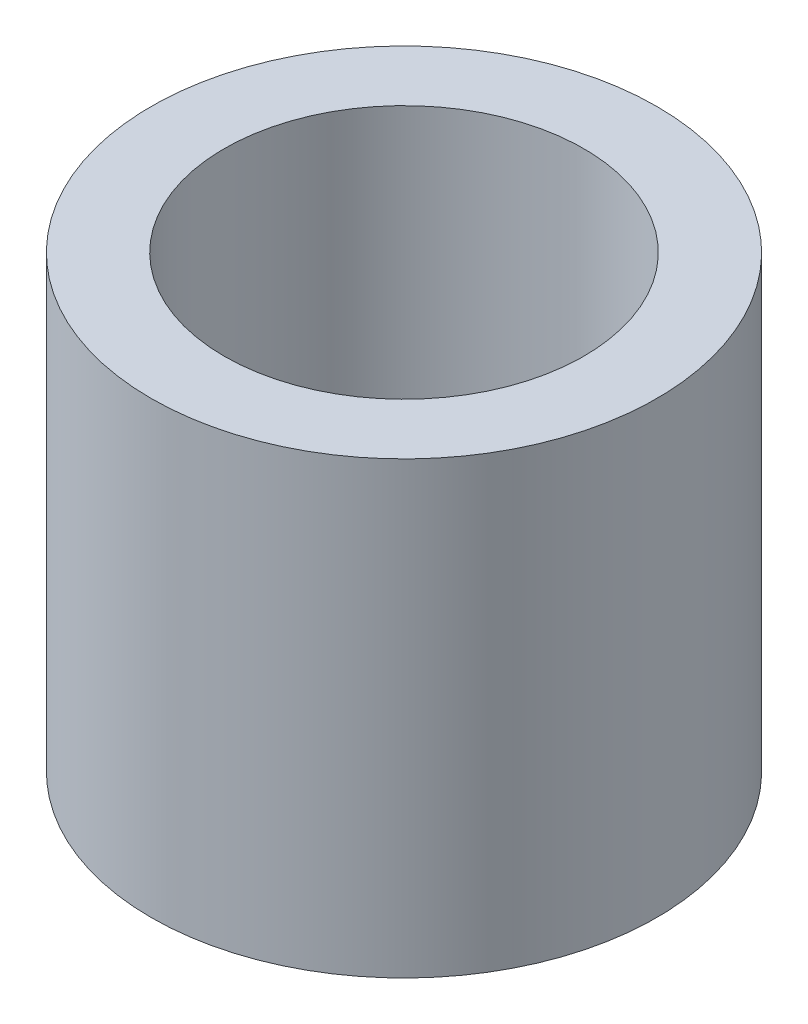
ISO-10303-21;
HEADER;
FILE_DESCRIPTION(('STEP AP214'),'2;1');
FILE_NAME('part.step','',(''),(''),'','','');
FILE_SCHEMA(('AUTOMOTIVE_DESIGN { 1 0 10303 214 1 1 1 1 }'));
ENDSEC;
DATA;
#1=APPLICATION_CONTEXT('core data for automotive mechanical design processes');
#2=APPLICATION_PROTOCOL_DEFINITION('international standard','automotive_design',2000,#1);
#3=PRODUCT_CONTEXT('',#1,'mechanical');
#4=PRODUCT('Part','Part','',(#3));
#5=PRODUCT_RELATED_PRODUCT_CATEGORY('part','',(#4));
#6=PRODUCT_DEFINITION_FORMATION('','',#4);
#7=PRODUCT_DEFINITION_CONTEXT('part definition',#1,'design');
#8=PRODUCT_DEFINITION('design','',#6,#7);
#9=PRODUCT_DEFINITION_SHAPE('','',#8);
#10=(LENGTH_UNIT() NAMED_UNIT(*) SI_UNIT(.MILLI.,.METRE.));
#11=(NAMED_UNIT(*) PLANE_ANGLE_UNIT() SI_UNIT($,.RADIAN.));
#12=(NAMED_UNIT(*) SI_UNIT($,.STERADIAN.) SOLID_ANGLE_UNIT());
#13=UNCERTAINTY_MEASURE_WITH_UNIT(LENGTH_MEASURE(1.E-05),#10,'distance_accuracy_value','');
#14=(GEOMETRIC_REPRESENTATION_CONTEXT(3) GLOBAL_UNCERTAINTY_ASSIGNED_CONTEXT((#13)) GLOBAL_UNIT_ASSIGNED_CONTEXT((#10,
#11,#12)) REPRESENTATION_CONTEXT('',''));
#15=CARTESIAN_POINT('',(0.,0.,0.));
#16=DIRECTION('',(0.,0.,1.));
#17=DIRECTION('',(1.,0.,0.));
#18=AXIS2_PLACEMENT_3D('',#15,#16,#17);
#19=CARTESIAN_POINT('',(0.,4.,0.));
#20=DIRECTION('',(0.,1.,0.));
#21=DIRECTION('',(0.,0.,1.));
#22=AXIS2_PLACEMENT_3D('',#19,#20,#21);
#23=PLANE('',#22);
#24=CARTESIAN_POINT('',(0.,4.,0.));
#25=DIRECTION('',(0.,1.,0.));
#26=DIRECTION('',(0.,0.,1.));
#27=AXIS2_PLACEMENT_3D('',#24,#25,#26);
#28=CIRCLE('',#27,2.25);
#29=CARTESIAN_POINT('',(0.,4.,2.25));
#30=VERTEX_POINT('',#29);
#31=EDGE_CURVE('E10',#30,#30,#28,.T.);
#32=ORIENTED_EDGE('',*,*,#31,.T.);
#33=EDGE_LOOP('',(#32));
#34=FACE_BOUND('',#33,.T.);
#35=CARTESIAN_POINT('',(0.,4.,0.));
#36=DIRECTION('',(0.,1.,0.));
#37=DIRECTION('',(0.,0.,1.));
#38=AXIS2_PLACEMENT_3D('',#35,#36,#37);
#39=CIRCLE('',#38,1.6);
#40=CARTESIAN_POINT('',(0.,4.,1.6));
#41=VERTEX_POINT('',#40);
#42=EDGE_CURVE('E50',#41,#41,#39,.T.);
#43=ORIENTED_EDGE('',*,*,#42,.F.);
#44=EDGE_LOOP('',(#43));
#45=FACE_BOUND('',#44,.T.);
#46=ADVANCED_FACE('F39',(#34,#45),#23,.T.);
#47=CARTESIAN_POINT('',(0.,0.,0.));
#48=DIRECTION('',(0.,1.,0.));
#49=DIRECTION('',(0.,0.,1.));
#50=AXIS2_PLACEMENT_3D('',#47,#48,#49);
#51=PLANE('',#50);
#52=CARTESIAN_POINT('',(0.,0.,0.));
#53=DIRECTION('',(0.,1.,0.));
#54=DIRECTION('',(0.,0.,1.));
#55=AXIS2_PLACEMENT_3D('',#52,#53,#54);
#56=CIRCLE('',#55,2.25);
#57=CARTESIAN_POINT('',(0.,0.,2.25));
#58=VERTEX_POINT('',#57);
#59=EDGE_CURVE('E43',#58,#58,#56,.T.);
#60=ORIENTED_EDGE('',*,*,#59,.F.);
#61=EDGE_LOOP('',(#60));
#62=FACE_BOUND('',#61,.T.);
#63=CARTESIAN_POINT('',(0.,0.,0.));
#64=DIRECTION('',(0.,1.,0.));
#65=DIRECTION('',(0.,0.,1.));
#66=AXIS2_PLACEMENT_3D('',#63,#64,#65);
#67=CIRCLE('',#66,1.6);
#68=CARTESIAN_POINT('',(0.,0.,1.6));
#69=VERTEX_POINT('',#68);
#70=EDGE_CURVE('E52',#69,#69,#67,.T.);
#71=ORIENTED_EDGE('',*,*,#70,.T.);
#72=EDGE_LOOP('',(#71));
#73=FACE_BOUND('',#72,.T.);
#74=ADVANCED_FACE('F62',(#62,#73),#51,.F.);
#75=CARTESIAN_POINT('',(0.,4.,0.));
#76=DIRECTION('',(0.,-1.,0.));
#77=DIRECTION('',(0.,0.,-1.));
#78=AXIS2_PLACEMENT_3D('',#75,#76,#77);
#79=CYLINDRICAL_SURFACE('',#78,2.25);
#80=ORIENTED_EDGE('',*,*,#31,.F.);
#81=EDGE_LOOP('',(#80));
#82=FACE_BOUND('',#81,.T.);
#83=ORIENTED_EDGE('',*,*,#59,.T.);
#84=EDGE_LOOP('',(#83));
#85=FACE_BOUND('',#84,.T.);
#86=ADVANCED_FACE('F41',(#82,#85),#79,.T.);
#87=CARTESIAN_POINT('',(0.,4.,0.));
#88=DIRECTION('',(0.,-1.,0.));
#89=DIRECTION('',(0.,0.,-1.));
#90=AXIS2_PLACEMENT_3D('',#87,#88,#89);
#91=CYLINDRICAL_SURFACE('',#90,1.6);
#92=ORIENTED_EDGE('',*,*,#42,.T.);
#93=EDGE_LOOP('',(#92));
#94=FACE_BOUND('',#93,.T.);
#95=ORIENTED_EDGE('',*,*,#70,.F.);
#96=EDGE_LOOP('',(#95));
#97=FACE_BOUND('',#96,.T.);
#98=ADVANCED_FACE('F58',(#94,#97),#91,.F.);
#99=CLOSED_SHELL('',(#46,#74,#86,#98));
#100=MANIFOLD_SOLID_BREP('B2',#99);
#101=ADVANCED_BREP_SHAPE_REPRESENTATION('',(#18,#100),#14);
#102=SHAPE_DEFINITION_REPRESENTATION(#9,#101);
ENDSEC;
END-ISO-10303-21;
